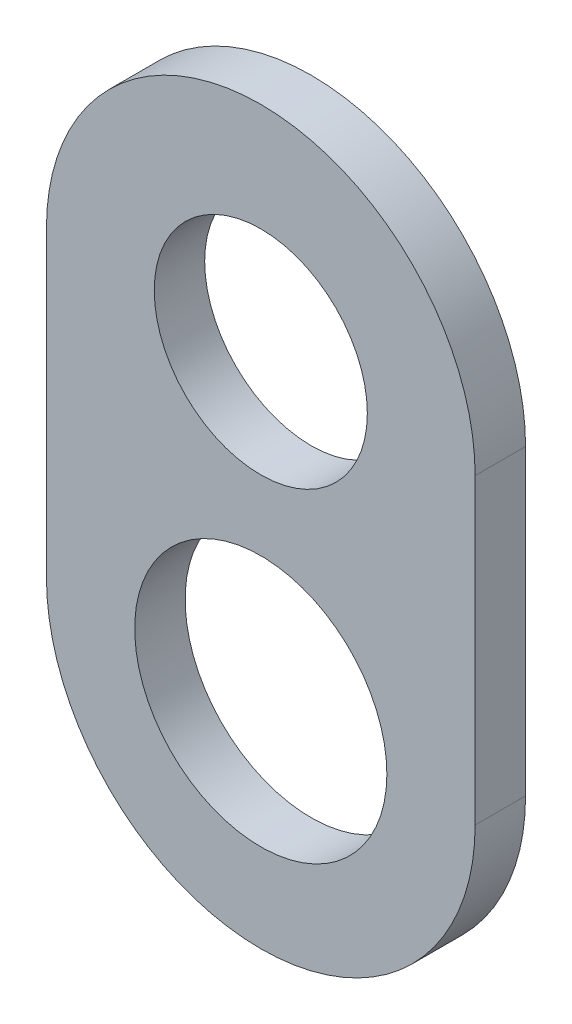
ISO-10303-21;
HEADER;
FILE_DESCRIPTION(('STEP AP214'),'2;1');
FILE_NAME('part.step','',(''),(''),'','','');
FILE_SCHEMA(('AUTOMOTIVE_DESIGN { 1 0 10303 214 1 1 1 1 }'));
ENDSEC;
DATA;
#1=APPLICATION_CONTEXT('core data for automotive mechanical design processes');
#2=APPLICATION_PROTOCOL_DEFINITION('international standard','automotive_design',2000,#1);
#3=PRODUCT_CONTEXT('',#1,'mechanical');
#4=PRODUCT('Part','Part','',(#3));
#5=PRODUCT_RELATED_PRODUCT_CATEGORY('part','',(#4));
#6=PRODUCT_DEFINITION_FORMATION('','',#4);
#7=PRODUCT_DEFINITION_CONTEXT('part definition',#1,'design');
#8=PRODUCT_DEFINITION('design','',#6,#7);
#9=PRODUCT_DEFINITION_SHAPE('','',#8);
#10=(LENGTH_UNIT() NAMED_UNIT(*) SI_UNIT(.MILLI.,.METRE.));
#11=(NAMED_UNIT(*) PLANE_ANGLE_UNIT() SI_UNIT($,.RADIAN.));
#12=(NAMED_UNIT(*) SI_UNIT($,.STERADIAN.) SOLID_ANGLE_UNIT());
#13=UNCERTAINTY_MEASURE_WITH_UNIT(LENGTH_MEASURE(1.E-05),#10,'distance_accuracy_value','');
#14=(GEOMETRIC_REPRESENTATION_CONTEXT(3) GLOBAL_UNCERTAINTY_ASSIGNED_CONTEXT((#13)) GLOBAL_UNIT_ASSIGNED_CONTEXT((#10,
#11,#12)) REPRESENTATION_CONTEXT('',''));
#15=CARTESIAN_POINT('',(0.,0.,0.));
#16=DIRECTION('',(0.,0.,1.));
#17=DIRECTION('',(1.,0.,0.));
#18=AXIS2_PLACEMENT_3D('',#15,#16,#17);
#19=CARTESIAN_POINT('',(0.,-30.48,5.08));
#20=DIRECTION('',(0.,0.,1.));
#21=DIRECTION('',(1.,0.,0.));
#22=AXIS2_PLACEMENT_3D('',#19,#20,#21);
#23=PLANE('',#22);
#24=CARTESIAN_POINT('',(0.,0.,5.08));
#25=DIRECTION('',(0.,0.,1.));
#26=DIRECTION('',(1.,0.,0.));
#27=AXIS2_PLACEMENT_3D('',#24,#25,#26);
#28=CIRCLE('',#27,10.7315);
#29=CARTESIAN_POINT('',(10.7315,0.,5.08));
#30=VERTEX_POINT('',#29);
#31=EDGE_CURVE('E109',#30,#30,#28,.T.);
#32=ORIENTED_EDGE('',*,*,#31,.F.);
#33=EDGE_LOOP('',(#32));
#34=FACE_BOUND('',#33,.T.);
#35=CARTESIAN_POINT('',(0.,-30.48,5.08));
#36=DIRECTION('',(0.,0.,1.));
#37=DIRECTION('',(1.,0.,0.));
#38=AXIS2_PLACEMENT_3D('',#35,#36,#37);
#39=CIRCLE('',#38,21.59);
#40=CARTESIAN_POINT('',(-21.59,-30.48,5.08));
#41=VERTEX_POINT('',#40);
#42=CARTESIAN_POINT('',(21.59,-30.48,5.08));
#43=VERTEX_POINT('',#42);
#44=EDGE_CURVE('E92',#41,#43,#39,.T.);
#45=ORIENTED_EDGE('',*,*,#44,.T.);
#46=DIRECTION('',(0.,1.,0.));
#47=VECTOR('',#46,1.);
#48=CARTESIAN_POINT('',(21.59,-30.48,5.08));
#49=LINE('',#48,#47);
#50=CARTESIAN_POINT('',(21.59,0.,5.08));
#51=VERTEX_POINT('',#50);
#52=EDGE_CURVE('E87',#43,#51,#49,.T.);
#53=ORIENTED_EDGE('',*,*,#52,.T.);
#54=CARTESIAN_POINT('',(0.,0.,5.08));
#55=DIRECTION('',(0.,0.,1.));
#56=DIRECTION('',(1.,0.,0.));
#57=AXIS2_PLACEMENT_3D('',#54,#55,#56);
#58=CIRCLE('',#57,21.59);
#59=CARTESIAN_POINT('',(-21.59,0.,5.08));
#60=VERTEX_POINT('',#59);
#61=EDGE_CURVE('E95',#51,#60,#58,.T.);
#62=ORIENTED_EDGE('',*,*,#61,.T.);
#63=DIRECTION('',(0.,-1.,0.));
#64=VECTOR('',#63,1.);
#65=CARTESIAN_POINT('',(-21.59,-30.48,5.08));
#66=LINE('',#65,#64);
#67=EDGE_CURVE('E56',#60,#41,#66,.T.);
#68=ORIENTED_EDGE('',*,*,#67,.T.);
#69=EDGE_LOOP('',(#45,#53,#62,#68));
#70=FACE_BOUND('',#69,.T.);
#71=CARTESIAN_POINT('',(0.,-30.48,5.08));
#72=DIRECTION('',(0.,0.,1.));
#73=DIRECTION('',(1.,0.,0.));
#74=AXIS2_PLACEMENT_3D('',#71,#72,#73);
#75=CIRCLE('',#74,12.7);
#76=CARTESIAN_POINT('',(12.7,-30.48,5.08));
#77=VERTEX_POINT('',#76);
#78=EDGE_CURVE('E125',#77,#77,#75,.T.);
#79=ORIENTED_EDGE('',*,*,#78,.F.);
#80=EDGE_LOOP('',(#79));
#81=FACE_BOUND('',#80,.T.);
#82=ADVANCED_FACE('F45',(#34,#70,#81),#23,.T.);
#83=CARTESIAN_POINT('',(0.,-30.48,0.));
#84=DIRECTION('',(0.,0.,1.));
#85=DIRECTION('',(1.,0.,0.));
#86=AXIS2_PLACEMENT_3D('',#83,#84,#85);
#87=PLANE('',#86);
#88=CARTESIAN_POINT('',(0.,-30.48,0.));
#89=DIRECTION('',(0.,0.,1.));
#90=DIRECTION('',(1.,0.,0.));
#91=AXIS2_PLACEMENT_3D('',#88,#89,#90);
#92=CIRCLE('',#91,21.59);
#93=CARTESIAN_POINT('',(-21.59,-30.48,0.));
#94=VERTEX_POINT('',#93);
#95=CARTESIAN_POINT('',(21.59,-30.48,0.));
#96=VERTEX_POINT('',#95);
#97=EDGE_CURVE('E108',#94,#96,#92,.T.);
#98=ORIENTED_EDGE('',*,*,#97,.F.);
#99=DIRECTION('',(0.,-1.,0.));
#100=VECTOR('',#99,1.);
#101=CARTESIAN_POINT('',(-21.59,-30.48,0.));
#102=LINE('',#101,#100);
#103=CARTESIAN_POINT('',(-21.59,0.,0.));
#104=VERTEX_POINT('',#103);
#105=EDGE_CURVE('E85',#104,#94,#102,.T.);
#106=ORIENTED_EDGE('',*,*,#105,.F.);
#107=CARTESIAN_POINT('',(0.,0.,0.));
#108=DIRECTION('',(0.,0.,1.));
#109=DIRECTION('',(1.,0.,0.));
#110=AXIS2_PLACEMENT_3D('',#107,#108,#109);
#111=CIRCLE('',#110,21.59);
#112=CARTESIAN_POINT('',(21.59,0.,0.));
#113=VERTEX_POINT('',#112);
#114=EDGE_CURVE('E78',#113,#104,#111,.T.);
#115=ORIENTED_EDGE('',*,*,#114,.F.);
#116=DIRECTION('',(0.,1.,0.));
#117=VECTOR('',#116,1.);
#118=CARTESIAN_POINT('',(21.59,-30.48,0.));
#119=LINE('',#118,#117);
#120=EDGE_CURVE('E97',#96,#113,#119,.T.);
#121=ORIENTED_EDGE('',*,*,#120,.F.);
#122=EDGE_LOOP('',(#98,#106,#115,#121));
#123=FACE_BOUND('',#122,.T.);
#124=CARTESIAN_POINT('',(0.,0.,0.));
#125=DIRECTION('',(0.,0.,1.));
#126=DIRECTION('',(1.,0.,0.));
#127=AXIS2_PLACEMENT_3D('',#124,#125,#126);
#128=CIRCLE('',#127,10.7315);
#129=CARTESIAN_POINT('',(10.7315,0.,0.));
#130=VERTEX_POINT('',#129);
#131=EDGE_CURVE('E123',#130,#130,#128,.T.);
#132=ORIENTED_EDGE('',*,*,#131,.T.);
#133=EDGE_LOOP('',(#132));
#134=FACE_BOUND('',#133,.T.);
#135=CARTESIAN_POINT('',(0.,-30.48,0.));
#136=DIRECTION('',(0.,0.,1.));
#137=DIRECTION('',(1.,0.,0.));
#138=AXIS2_PLACEMENT_3D('',#135,#136,#137);
#139=CIRCLE('',#138,12.7);
#140=CARTESIAN_POINT('',(12.7,-30.48,0.));
#141=VERTEX_POINT('',#140);
#142=EDGE_CURVE('E130',#141,#141,#139,.T.);
#143=ORIENTED_EDGE('',*,*,#142,.T.);
#144=EDGE_LOOP('',(#143));
#145=FACE_BOUND('',#144,.T.);
#146=ADVANCED_FACE('F120',(#123,#134,#145),#87,.F.);
#147=CARTESIAN_POINT('',(0.,-30.48,5.08));
#148=DIRECTION('',(0.,0.,-1.));
#149=DIRECTION('',(-1.,0.,0.));
#150=AXIS2_PLACEMENT_3D('',#147,#148,#149);
#151=CYLINDRICAL_SURFACE('',#150,21.59);
#152=ORIENTED_EDGE('',*,*,#97,.T.);
#153=DIRECTION('',(0.,0.,-1.));
#154=VECTOR('',#153,1.);
#155=CARTESIAN_POINT('',(21.59,-30.48,5.08));
#156=LINE('',#155,#154);
#157=EDGE_CURVE('E11',#43,#96,#156,.T.);
#158=ORIENTED_EDGE('',*,*,#157,.F.);
#159=ORIENTED_EDGE('',*,*,#44,.F.);
#160=DIRECTION('',(0.,0.,-1.));
#161=VECTOR('',#160,1.);
#162=CARTESIAN_POINT('',(-21.59,-30.48,5.08));
#163=LINE('',#162,#161);
#164=EDGE_CURVE('E105',#41,#94,#163,.T.);
#165=ORIENTED_EDGE('',*,*,#164,.T.);
#166=EDGE_LOOP('',(#152,#158,#159,#165));
#167=FACE_BOUND('',#166,.T.);
#168=ADVANCED_FACE('F42',(#167),#151,.T.);
#169=CARTESIAN_POINT('',(21.59,-30.48,5.08));
#170=DIRECTION('',(-1.,0.,0.));
#171=DIRECTION('',(0.,0.,1.));
#172=AXIS2_PLACEMENT_3D('',#169,#170,#171);
#173=PLANE('',#172);
#174=ORIENTED_EDGE('',*,*,#120,.T.);
#175=DIRECTION('',(0.,0.,-1.));
#176=VECTOR('',#175,1.);
#177=CARTESIAN_POINT('',(21.59,0.,5.08));
#178=LINE('',#177,#176);
#179=EDGE_CURVE('E51',#51,#113,#178,.T.);
#180=ORIENTED_EDGE('',*,*,#179,.F.);
#181=ORIENTED_EDGE('',*,*,#52,.F.);
#182=ORIENTED_EDGE('',*,*,#157,.T.);
#183=EDGE_LOOP('',(#174,#180,#181,#182));
#184=FACE_BOUND('',#183,.T.);
#185=ADVANCED_FACE('F100',(#184),#173,.F.);
#186=CARTESIAN_POINT('',(0.,0.,5.08));
#187=DIRECTION('',(0.,0.,-1.));
#188=DIRECTION('',(-1.,0.,0.));
#189=AXIS2_PLACEMENT_3D('',#186,#187,#188);
#190=CYLINDRICAL_SURFACE('',#189,21.59);
#191=ORIENTED_EDGE('',*,*,#114,.T.);
#192=DIRECTION('',(0.,0.,-1.));
#193=VECTOR('',#192,1.);
#194=CARTESIAN_POINT('',(-21.59,0.,5.08));
#195=LINE('',#194,#193);
#196=EDGE_CURVE('E98',#60,#104,#195,.T.);
#197=ORIENTED_EDGE('',*,*,#196,.F.);
#198=ORIENTED_EDGE('',*,*,#61,.F.);
#199=ORIENTED_EDGE('',*,*,#179,.T.);
#200=EDGE_LOOP('',(#191,#197,#198,#199));
#201=FACE_BOUND('',#200,.T.);
#202=ADVANCED_FACE('F99',(#201),#190,.T.);
#203=CARTESIAN_POINT('',(-21.59,-30.48,5.08));
#204=DIRECTION('',(1.,0.,0.));
#205=DIRECTION('',(0.,0.,-1.));
#206=AXIS2_PLACEMENT_3D('',#203,#204,#205);
#207=PLANE('',#206);
#208=ORIENTED_EDGE('',*,*,#105,.T.);
#209=ORIENTED_EDGE('',*,*,#164,.F.);
#210=ORIENTED_EDGE('',*,*,#67,.F.);
#211=ORIENTED_EDGE('',*,*,#196,.T.);
#212=EDGE_LOOP('',(#208,#209,#210,#211));
#213=FACE_BOUND('',#212,.T.);
#214=ADVANCED_FACE('F114',(#213),#207,.F.);
#215=CARTESIAN_POINT('',(0.,0.,5.08));
#216=DIRECTION('',(0.,0.,-1.));
#217=DIRECTION('',(-1.,0.,0.));
#218=AXIS2_PLACEMENT_3D('',#215,#216,#217);
#219=CYLINDRICAL_SURFACE('',#218,10.7315);
#220=ORIENTED_EDGE('',*,*,#31,.T.);
#221=EDGE_LOOP('',(#220));
#222=FACE_BOUND('',#221,.T.);
#223=ORIENTED_EDGE('',*,*,#131,.F.);
#224=EDGE_LOOP('',(#223));
#225=FACE_BOUND('',#224,.T.);
#226=ADVANCED_FACE('F143',(#222,#225),#219,.F.);
#227=CARTESIAN_POINT('',(0.,-30.48,5.08));
#228=DIRECTION('',(0.,0.,-1.));
#229=DIRECTION('',(-1.,0.,0.));
#230=AXIS2_PLACEMENT_3D('',#227,#228,#229);
#231=CYLINDRICAL_SURFACE('',#230,12.7);
#232=ORIENTED_EDGE('',*,*,#78,.T.);
#233=EDGE_LOOP('',(#232));
#234=FACE_BOUND('',#233,.T.);
#235=ORIENTED_EDGE('',*,*,#142,.F.);
#236=EDGE_LOOP('',(#235));
#237=FACE_BOUND('',#236,.T.);
#238=ADVANCED_FACE('F133',(#234,#237),#231,.F.);
#239=CLOSED_SHELL('',(#82,#146,#168,#185,#202,#214,#226,#238));
#240=MANIFOLD_SOLID_BREP('B2',#239);
#241=ADVANCED_BREP_SHAPE_REPRESENTATION('',(#18,#240),#14);
#242=SHAPE_DEFINITION_REPRESENTATION(#9,#241);
ENDSEC;
END-ISO-10303-21;
